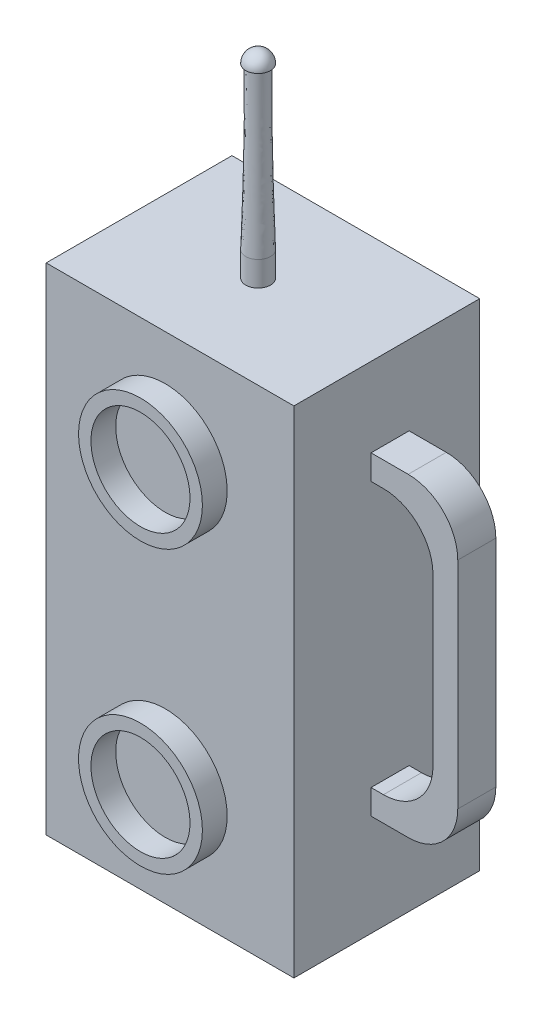
ISO-10303-21;
HEADER;
FILE_DESCRIPTION(('STEP AP214'),'2;1');
FILE_NAME('part.step','',(''),(''),'','','');
FILE_SCHEMA(('AUTOMOTIVE_DESIGN { 1 0 10303 214 1 1 1 1 }'));
ENDSEC;
DATA;
#1=APPLICATION_CONTEXT('core data for automotive mechanical design processes');
#2=APPLICATION_PROTOCOL_DEFINITION('international standard','automotive_design',2000,#1);
#3=PRODUCT_CONTEXT('',#1,'mechanical');
#4=PRODUCT('Part','Part','',(#3));
#5=PRODUCT_RELATED_PRODUCT_CATEGORY('part','',(#4));
#6=PRODUCT_DEFINITION_FORMATION('','',#4);
#7=PRODUCT_DEFINITION_CONTEXT('part definition',#1,'design');
#8=PRODUCT_DEFINITION('design','',#6,#7);
#9=PRODUCT_DEFINITION_SHAPE('','',#8);
#10=(LENGTH_UNIT() NAMED_UNIT(*) SI_UNIT(.MILLI.,.METRE.));
#11=(NAMED_UNIT(*) PLANE_ANGLE_UNIT() SI_UNIT($,.RADIAN.));
#12=(NAMED_UNIT(*) SI_UNIT($,.STERADIAN.) SOLID_ANGLE_UNIT());
#13=UNCERTAINTY_MEASURE_WITH_UNIT(LENGTH_MEASURE(1.E-05),#10,'distance_accuracy_value','');
#14=(GEOMETRIC_REPRESENTATION_CONTEXT(3) GLOBAL_UNCERTAINTY_ASSIGNED_CONTEXT((#13)) GLOBAL_UNIT_ASSIGNED_CONTEXT((#10,
#11,#12)) REPRESENTATION_CONTEXT('',''));
#15=CARTESIAN_POINT('',(0.,0.,0.));
#16=DIRECTION('',(0.,0.,1.));
#17=DIRECTION('',(1.,0.,0.));
#18=AXIS2_PLACEMENT_3D('',#15,#16,#17);
#19=CARTESIAN_POINT('',(10.,0.,7.5));
#20=DIRECTION('',(-1.,0.,0.));
#21=DIRECTION('',(0.,0.,1.));
#22=AXIS2_PLACEMENT_3D('',#19,#20,#21);
#23=PLANE('',#22);
#24=DIRECTION('',(0.,0.,1.));
#25=VECTOR('',#24,1.);
#26=CARTESIAN_POINT('',(10.,5.10199449169218,-0.614410883447841));
#27=LINE('',#26,#25);
#28=CARTESIAN_POINT('',(10.,5.10199449169218,2.84891246229432));
#29=VERTEX_POINT('',#28);
#30=CARTESIAN_POINT('',(10.,5.10199449169218,4.38558911655216));
#31=VERTEX_POINT('',#30);
#32=EDGE_CURVE('E222',#29,#31,#27,.T.);
#33=ORIENTED_EDGE('',*,*,#32,.F.);
#34=DIRECTION('',(0.,1.,0.));
#35=VECTOR('',#34,1.);
#36=CARTESIAN_POINT('',(10.,16.8021750754114,2.84891246229432));
#37=LINE('',#36,#35);
#38=CARTESIAN_POINT('',(10.,4.10199449169218,2.84891246229432));
#39=VERTEX_POINT('',#38);
#40=EDGE_CURVE('E241',#39,#29,#37,.T.);
#41=ORIENTED_EDGE('',*,*,#40,.F.);
#42=DIRECTION('',(0.,0.,-1.));
#43=VECTOR('',#42,1.);
#44=CARTESIAN_POINT('',(10.,4.10199449169218,2.84891246229432));
#45=LINE('',#44,#43);
#46=CARTESIAN_POINT('',(10.,4.10199449169218,4.38558911655216));
#47=VERTEX_POINT('',#46);
#48=EDGE_CURVE('E237',#47,#39,#45,.T.);
#49=ORIENTED_EDGE('',*,*,#48,.F.);
#50=DIRECTION('',(0.,-1.,0.));
#51=VECTOR('',#50,1.);
#52=CARTESIAN_POINT('',(10.,4.10199449169218,4.38558911655216));
#53=LINE('',#52,#51);
#54=EDGE_CURVE('E224',#31,#47,#53,.T.);
#55=ORIENTED_EDGE('',*,*,#54,.F.);
#56=EDGE_LOOP('',(#33,#41,#49,#55));
#57=FACE_BOUND('',#56,.T.);
#58=DIRECTION('',(0.,1.,0.));
#59=VECTOR('',#58,1.);
#60=CARTESIAN_POINT('',(10.,0.,0.));
#61=LINE('',#60,#59);
#62=CARTESIAN_POINT('',(10.,0.,0.));
#63=VERTEX_POINT('',#62);
#64=CARTESIAN_POINT('',(10.,20.,0.));
#65=VERTEX_POINT('',#64);
#66=EDGE_CURVE('E297',#63,#65,#61,.T.);
#67=ORIENTED_EDGE('',*,*,#66,.T.);
#68=DIRECTION('',(0.,0.,-1.));
#69=VECTOR('',#68,1.);
#70=CARTESIAN_POINT('',(10.,20.,7.5));
#71=LINE('',#70,#69);
#72=CARTESIAN_POINT('',(10.,20.,7.5));
#73=VERTEX_POINT('',#72);
#74=EDGE_CURVE('E302',#73,#65,#71,.T.);
#75=ORIENTED_EDGE('',*,*,#74,.F.);
#76=DIRECTION('',(0.,1.,0.));
#77=VECTOR('',#76,1.);
#78=CARTESIAN_POINT('',(10.,0.,7.5));
#79=LINE('',#78,#77);
#80=CARTESIAN_POINT('',(10.,0.,7.5));
#81=VERTEX_POINT('',#80);
#82=EDGE_CURVE('E288',#81,#73,#79,.T.);
#83=ORIENTED_EDGE('',*,*,#82,.F.);
#84=DIRECTION('',(0.,0.,-1.));
#85=VECTOR('',#84,1.);
#86=CARTESIAN_POINT('',(10.,0.,7.5));
#87=LINE('',#86,#85);
#88=EDGE_CURVE('E305',#81,#63,#87,.T.);
#89=ORIENTED_EDGE('',*,*,#88,.T.);
#90=EDGE_LOOP('',(#67,#75,#83,#89));
#91=FACE_BOUND('',#90,.T.);
#92=CARTESIAN_POINT('',(10.,15.8021750754114,2.84891246229432));
#93=VERTEX_POINT('',#92);
#94=CARTESIAN_POINT('',(10.,16.8021750754114,2.84891246229432));
#95=VERTEX_POINT('',#94);
#96=EDGE_CURVE('E240',#93,#95,#37,.T.);
#97=ORIENTED_EDGE('',*,*,#96,.F.);
#98=DIRECTION('',(0.,0.,1.));
#99=VECTOR('',#98,1.);
#100=CARTESIAN_POINT('',(10.,15.8021750754114,-0.614410883447841));
#101=LINE('',#100,#99);
#102=CARTESIAN_POINT('',(10.,15.8021750754114,4.38558911655216));
#103=VERTEX_POINT('',#102);
#104=EDGE_CURVE('E221',#93,#103,#101,.T.);
#105=ORIENTED_EDGE('',*,*,#104,.T.);
#106=CARTESIAN_POINT('',(10.,16.8021750754114,4.38558911655216));
#107=VERTEX_POINT('',#106);
#108=EDGE_CURVE('E234',#107,#103,#53,.T.);
#109=ORIENTED_EDGE('',*,*,#108,.F.);
#110=DIRECTION('',(0.,0.,1.));
#111=VECTOR('',#110,1.);
#112=CARTESIAN_POINT('',(10.,16.8021750754114,4.38558911655216));
#113=LINE('',#112,#111);
#114=EDGE_CURVE('E231',#95,#107,#113,.T.);
#115=ORIENTED_EDGE('',*,*,#114,.F.);
#116=EDGE_LOOP('',(#97,#105,#109,#115));
#117=FACE_BOUND('',#116,.T.);
#118=ADVANCED_FACE('F53',(#57,#91,#117),#23,.F.);
#119=CARTESIAN_POINT('',(0.,0.,7.5));
#120=DIRECTION('',(1.,0.,0.));
#121=DIRECTION('',(0.,0.,-1.));
#122=AXIS2_PLACEMENT_3D('',#119,#120,#121);
#123=PLANE('',#122);
#124=DIRECTION('',(0.,-1.,0.));
#125=VECTOR('',#124,1.);
#126=CARTESIAN_POINT('',(0.,0.,0.));
#127=LINE('',#126,#125);
#128=CARTESIAN_POINT('',(0.,20.,0.));
#129=VERTEX_POINT('',#128);
#130=CARTESIAN_POINT('',(0.,0.,0.));
#131=VERTEX_POINT('',#130);
#132=EDGE_CURVE('E281',#129,#131,#127,.T.);
#133=ORIENTED_EDGE('',*,*,#132,.T.);
#134=DIRECTION('',(0.,0.,-1.));
#135=VECTOR('',#134,1.);
#136=CARTESIAN_POINT('',(0.,0.,7.5));
#137=LINE('',#136,#135);
#138=CARTESIAN_POINT('',(0.,0.,7.5));
#139=VERTEX_POINT('',#138);
#140=EDGE_CURVE('E308',#139,#131,#137,.T.);
#141=ORIENTED_EDGE('',*,*,#140,.F.);
#142=DIRECTION('',(0.,-1.,0.));
#143=VECTOR('',#142,1.);
#144=CARTESIAN_POINT('',(0.,0.,7.5));
#145=LINE('',#144,#143);
#146=CARTESIAN_POINT('',(0.,20.,7.5));
#147=VERTEX_POINT('',#146);
#148=EDGE_CURVE('E282',#147,#139,#145,.T.);
#149=ORIENTED_EDGE('',*,*,#148,.F.);
#150=DIRECTION('',(0.,0.,-1.));
#151=VECTOR('',#150,1.);
#152=CARTESIAN_POINT('',(0.,20.,7.5));
#153=LINE('',#152,#151);
#154=EDGE_CURVE('E292',#147,#129,#153,.T.);
#155=ORIENTED_EDGE('',*,*,#154,.T.);
#156=EDGE_LOOP('',(#133,#141,#149,#155));
#157=FACE_BOUND('',#156,.T.);
#158=ADVANCED_FACE('F421',(#157),#123,.F.);
#159=CARTESIAN_POINT('',(0.,0.,7.5));
#160=DIRECTION('',(0.,1.,0.));
#161=DIRECTION('',(0.,0.,1.));
#162=AXIS2_PLACEMENT_3D('',#159,#160,#161);
#163=PLANE('',#162);
#164=DIRECTION('',(1.,0.,0.));
#165=VECTOR('',#164,1.);
#166=CARTESIAN_POINT('',(0.,0.,0.));
#167=LINE('',#166,#165);
#168=EDGE_CURVE('E295',#131,#63,#167,.T.);
#169=ORIENTED_EDGE('',*,*,#168,.T.);
#170=ORIENTED_EDGE('',*,*,#88,.F.);
#171=DIRECTION('',(1.,0.,0.));
#172=VECTOR('',#171,1.);
#173=CARTESIAN_POINT('',(0.,0.,7.5));
#174=LINE('',#173,#172);
#175=EDGE_CURVE('E285',#139,#81,#174,.T.);
#176=ORIENTED_EDGE('',*,*,#175,.F.);
#177=ORIENTED_EDGE('',*,*,#140,.T.);
#178=EDGE_LOOP('',(#169,#170,#176,#177));
#179=FACE_BOUND('',#178,.T.);
#180=ADVANCED_FACE('F441',(#179),#163,.F.);
#181=CARTESIAN_POINT('',(0.,20.,7.5));
#182=DIRECTION('',(0.,-1.,0.));
#183=DIRECTION('',(0.,0.,-1.));
#184=AXIS2_PLACEMENT_3D('',#181,#182,#183);
#185=PLANE('',#184);
#186=CARTESIAN_POINT('',(4.80630126206834,20.,3.75));
#187=DIRECTION('',(0.,-1.,0.));
#188=DIRECTION('',(0.,0.,-1.));
#189=AXIS2_PLACEMENT_3D('',#186,#187,#188);
#190=CIRCLE('',#189,0.500000000000001);
#191=CARTESIAN_POINT('',(4.80630126206834,20.,3.25));
#192=VERTEX_POINT('',#191);
#193=EDGE_CURVE('E314',#192,#192,#190,.F.);
#194=ORIENTED_EDGE('',*,*,#193,.F.);
#195=EDGE_LOOP('',(#194));
#196=FACE_BOUND('',#195,.T.);
#197=DIRECTION('',(-1.,0.,0.));
#198=VECTOR('',#197,1.);
#199=CARTESIAN_POINT('',(0.,20.,0.));
#200=LINE('',#199,#198);
#201=EDGE_CURVE('E286',#65,#129,#200,.T.);
#202=ORIENTED_EDGE('',*,*,#201,.T.);
#203=ORIENTED_EDGE('',*,*,#154,.F.);
#204=DIRECTION('',(-1.,0.,0.));
#205=VECTOR('',#204,1.);
#206=CARTESIAN_POINT('',(0.,20.,7.5));
#207=LINE('',#206,#205);
#208=EDGE_CURVE('E290',#73,#147,#207,.T.);
#209=ORIENTED_EDGE('',*,*,#208,.F.);
#210=ORIENTED_EDGE('',*,*,#74,.T.);
#211=EDGE_LOOP('',(#202,#203,#209,#210));
#212=FACE_BOUND('',#211,.T.);
#213=ADVANCED_FACE('F431',(#196,#212),#185,.F.);
#214=CARTESIAN_POINT('',(0.,0.,7.5));
#215=DIRECTION('',(0.,0.,-1.));
#216=DIRECTION('',(-1.,0.,0.));
#217=AXIS2_PLACEMENT_3D('',#214,#215,#216);
#218=PLANE('',#217);
#219=CARTESIAN_POINT('',(4.80630126206834,4.3181703540046,7.5));
#220=DIRECTION('',(0.,0.,-1.));
#221=DIRECTION('',(1.,0.,0.));
#222=AXIS2_PLACEMENT_3D('',#219,#220,#221);
#223=CIRCLE('',#222,2.5);
#224=CARTESIAN_POINT('',(7.30630126206834,4.3181703540046,7.5));
#225=VERTEX_POINT('',#224);
#226=EDGE_CURVE('E263',#225,#225,#223,.T.);
#227=ORIENTED_EDGE('',*,*,#226,.T.);
#228=EDGE_LOOP('',(#227));
#229=FACE_BOUND('',#228,.T.);
#230=CARTESIAN_POINT('',(4.80630126206834,15.6818296459954,7.5));
#231=DIRECTION('',(0.,0.,-1.));
#232=DIRECTION('',(-1.,0.,0.));
#233=AXIS2_PLACEMENT_3D('',#230,#231,#232);
#234=CIRCLE('',#233,2.5);
#235=CARTESIAN_POINT('',(2.30630126206834,15.6818296459954,7.5));
#236=VERTEX_POINT('',#235);
#237=EDGE_CURVE('E311',#236,#236,#234,.F.);
#238=ORIENTED_EDGE('',*,*,#237,.F.);
#239=EDGE_LOOP('',(#238));
#240=FACE_BOUND('',#239,.T.);
#241=ORIENTED_EDGE('',*,*,#148,.T.);
#242=ORIENTED_EDGE('',*,*,#175,.T.);
#243=ORIENTED_EDGE('',*,*,#82,.T.);
#244=ORIENTED_EDGE('',*,*,#208,.T.);
#245=EDGE_LOOP('',(#241,#242,#243,#244));
#246=FACE_BOUND('',#245,.T.);
#247=ADVANCED_FACE('F439',(#229,#240,#246),#218,.F.);
#248=CARTESIAN_POINT('',(0.,0.,0.));
#249=DIRECTION('',(0.,0.,-1.));
#250=DIRECTION('',(-1.,0.,0.));
#251=AXIS2_PLACEMENT_3D('',#248,#249,#250);
#252=PLANE('',#251);
#253=DIRECTION('',(0.,-1.,0.));
#254=VECTOR('',#253,1.);
#255=CARTESIAN_POINT('',(6.47882176689568,12.4860425935454,0.));
#256=LINE('',#255,#254);
#257=CARTESIAN_POINT('',(6.47882176689568,12.4860425935454,0.));
#258=VERTEX_POINT('',#257);
#259=CARTESIAN_POINT('',(6.47882176689567,8.48604259354542,0.));
#260=VERTEX_POINT('',#259);
#261=EDGE_CURVE('E68',#258,#260,#256,.T.);
#262=ORIENTED_EDGE('',*,*,#261,.F.);
#263=DIRECTION('',(1.,0.,0.));
#264=VECTOR('',#263,1.);
#265=CARTESIAN_POINT('',(6.47882176689568,12.4860425935454,0.));
#266=LINE('',#265,#264);
#267=CARTESIAN_POINT('',(2.47882176689568,12.4860425935454,0.));
#268=VERTEX_POINT('',#267);
#269=EDGE_CURVE('E72',#268,#258,#266,.T.);
#270=ORIENTED_EDGE('',*,*,#269,.F.);
#271=DIRECTION('',(0.,1.,0.));
#272=VECTOR('',#271,1.);
#273=CARTESIAN_POINT('',(2.47882176689568,12.4860425935454,0.));
#274=LINE('',#273,#272);
#275=CARTESIAN_POINT('',(2.47882176689567,8.48604259354542,0.));
#276=VERTEX_POINT('',#275);
#277=EDGE_CURVE('E774',#276,#268,#274,.T.);
#278=ORIENTED_EDGE('',*,*,#277,.F.);
#279=DIRECTION('',(-1.,0.,0.));
#280=VECTOR('',#279,1.);
#281=CARTESIAN_POINT('',(6.47882176689567,8.48604259354542,0.));
#282=LINE('',#281,#280);
#283=EDGE_CURVE('E780',#260,#276,#282,.T.);
#284=ORIENTED_EDGE('',*,*,#283,.F.);
#285=EDGE_LOOP('',(#262,#270,#278,#284));
#286=FACE_BOUND('',#285,.T.);
#287=ORIENTED_EDGE('',*,*,#132,.F.);
#288=ORIENTED_EDGE('',*,*,#201,.F.);
#289=ORIENTED_EDGE('',*,*,#66,.F.);
#290=ORIENTED_EDGE('',*,*,#168,.F.);
#291=EDGE_LOOP('',(#287,#288,#289,#290));
#292=FACE_BOUND('',#291,.T.);
#293=ADVANCED_FACE('F434',(#286,#292),#252,.T.);
#294=CARTESIAN_POINT('',(4.80630126206834,15.6818296459954,8.5));
#295=DIRECTION('',(0.,0.,-1.));
#296=DIRECTION('',(-1.,0.,0.));
#297=AXIS2_PLACEMENT_3D('',#294,#295,#296);
#298=CYLINDRICAL_SURFACE('',#297,2.5);
#299=CARTESIAN_POINT('',(4.80630126206834,15.6818296459954,8.5));
#300=DIRECTION('',(0.,0.,1.));
#301=DIRECTION('',(1.,0.,0.));
#302=AXIS2_PLACEMENT_3D('',#299,#300,#301);
#303=CIRCLE('',#302,2.5);
#304=CARTESIAN_POINT('',(7.30630126206834,15.6818296459954,8.5));
#305=VERTEX_POINT('',#304);
#306=EDGE_CURVE('E276',#305,#305,#303,.T.);
#307=ORIENTED_EDGE('',*,*,#306,.F.);
#308=EDGE_LOOP('',(#307));
#309=FACE_BOUND('',#308,.T.);
#310=ORIENTED_EDGE('',*,*,#237,.T.);
#311=EDGE_LOOP('',(#310));
#312=FACE_BOUND('',#311,.T.);
#313=ADVANCED_FACE('F540',(#309,#312),#298,.T.);
#314=CARTESIAN_POINT('',(4.80630126206834,15.6818296459954,8.5));
#315=DIRECTION('',(0.,0.,1.));
#316=DIRECTION('',(1.,0.,0.));
#317=AXIS2_PLACEMENT_3D('',#314,#315,#316);
#318=PLANE('',#317);
#319=CARTESIAN_POINT('',(4.80630126206834,15.6818296459954,8.5));
#320=DIRECTION('',(0.,0.,1.));
#321=DIRECTION('',(1.,0.,0.));
#322=AXIS2_PLACEMENT_3D('',#319,#320,#321);
#323=CIRCLE('',#322,2.);
#324=CARTESIAN_POINT('',(6.80630126206834,15.6818296459954,8.5));
#325=VERTEX_POINT('',#324);
#326=EDGE_CURVE('E270',#325,#325,#323,.T.);
#327=ORIENTED_EDGE('',*,*,#326,.F.);
#328=EDGE_LOOP('',(#327));
#329=FACE_BOUND('',#328,.T.);
#330=ORIENTED_EDGE('',*,*,#306,.T.);
#331=EDGE_LOOP('',(#330));
#332=FACE_BOUND('',#331,.T.);
#333=ADVANCED_FACE('F536',(#329,#332),#318,.T.);
#334=CARTESIAN_POINT('',(4.80630126206834,15.6818296459954,7.5));
#335=DIRECTION('',(0.,0.,1.));
#336=DIRECTION('',(1.,0.,0.));
#337=AXIS2_PLACEMENT_3D('',#334,#335,#336);
#338=CYLINDRICAL_SURFACE('',#337,2.);
#339=CARTESIAN_POINT('',(4.80630126206834,15.6818296459954,7.5));
#340=DIRECTION('',(0.,0.,1.));
#341=DIRECTION('',(1.,0.,0.));
#342=AXIS2_PLACEMENT_3D('',#339,#340,#341);
#343=CIRCLE('',#342,2.);
#344=CARTESIAN_POINT('',(6.80630126206834,15.6818296459954,7.5));
#345=VERTEX_POINT('',#344);
#346=EDGE_CURVE('E273',#345,#345,#343,.T.);
#347=ORIENTED_EDGE('',*,*,#346,.F.);
#348=EDGE_LOOP('',(#347));
#349=FACE_BOUND('',#348,.T.);
#350=ORIENTED_EDGE('',*,*,#326,.T.);
#351=EDGE_LOOP('',(#350));
#352=FACE_BOUND('',#351,.T.);
#353=ADVANCED_FACE('F532',(#349,#352),#338,.F.);
#354=CARTESIAN_POINT('',(4.80630126206834,15.6818296459954,7.5));
#355=DIRECTION('',(0.,0.,1.));
#356=DIRECTION('',(1.,0.,0.));
#357=AXIS2_PLACEMENT_3D('',#354,#355,#356);
#358=PLANE('',#357);
#359=ORIENTED_EDGE('',*,*,#346,.T.);
#360=EDGE_LOOP('',(#359));
#361=FACE_BOUND('',#360,.T.);
#362=ADVANCED_FACE('F528',(#361),#358,.T.);
#363=CARTESIAN_POINT('',(4.80630126206834,4.3181703540046,8.5));
#364=DIRECTION('',(0.,0.,-1.));
#365=DIRECTION('',(-1.,0.,0.));
#366=AXIS2_PLACEMENT_3D('',#363,#364,#365);
#367=CYLINDRICAL_SURFACE('',#366,2.5);
#368=CARTESIAN_POINT('',(4.80630126206834,4.3181703540046,8.5));
#369=DIRECTION('',(0.,0.,-1.));
#370=DIRECTION('',(1.,0.,0.));
#371=AXIS2_PLACEMENT_3D('',#368,#369,#370);
#372=CIRCLE('',#371,2.5);
#373=CARTESIAN_POINT('',(7.30630126206834,4.3181703540046,8.5));
#374=VERTEX_POINT('',#373);
#375=EDGE_CURVE('E267',#374,#374,#372,.T.);
#376=ORIENTED_EDGE('',*,*,#375,.T.);
#377=EDGE_LOOP('',(#376));
#378=FACE_BOUND('',#377,.T.);
#379=ORIENTED_EDGE('',*,*,#226,.F.);
#380=EDGE_LOOP('',(#379));
#381=FACE_BOUND('',#380,.T.);
#382=ADVANCED_FACE('F524',(#378,#381),#367,.T.);
#383=CARTESIAN_POINT('',(4.80630126206834,4.3181703540046,8.5));
#384=DIRECTION('',(0.,0.,1.));
#385=DIRECTION('',(1.,0.,0.));
#386=AXIS2_PLACEMENT_3D('',#383,#384,#385);
#387=PLANE('',#386);
#388=CARTESIAN_POINT('',(4.80630126206834,4.3181703540046,8.5));
#389=DIRECTION('',(0.,0.,-1.));
#390=DIRECTION('',(1.,0.,0.));
#391=AXIS2_PLACEMENT_3D('',#388,#389,#390);
#392=CIRCLE('',#391,2.);
#393=CARTESIAN_POINT('',(6.80630126206834,4.3181703540046,8.5));
#394=VERTEX_POINT('',#393);
#395=EDGE_CURVE('E264',#394,#394,#392,.T.);
#396=ORIENTED_EDGE('',*,*,#395,.T.);
#397=EDGE_LOOP('',(#396));
#398=FACE_BOUND('',#397,.T.);
#399=ORIENTED_EDGE('',*,*,#375,.F.);
#400=EDGE_LOOP('',(#399));
#401=FACE_BOUND('',#400,.T.);
#402=ADVANCED_FACE('F520',(#398,#401),#387,.T.);
#403=CARTESIAN_POINT('',(4.80630126206834,4.3181703540046,7.5));
#404=DIRECTION('',(0.,0.,1.));
#405=DIRECTION('',(1.,0.,0.));
#406=AXIS2_PLACEMENT_3D('',#403,#404,#405);
#407=CYLINDRICAL_SURFACE('',#406,2.);
#408=CARTESIAN_POINT('',(4.80630126206834,4.3181703540046,7.5));
#409=DIRECTION('',(0.,0.,-1.));
#410=DIRECTION('',(1.,0.,0.));
#411=AXIS2_PLACEMENT_3D('',#408,#409,#410);
#412=CIRCLE('',#411,2.);
#413=CARTESIAN_POINT('',(6.80630126206834,4.3181703540046,7.5));
#414=VERTEX_POINT('',#413);
#415=EDGE_CURVE('E260',#414,#414,#412,.T.);
#416=ORIENTED_EDGE('',*,*,#415,.T.);
#417=EDGE_LOOP('',(#416));
#418=FACE_BOUND('',#417,.T.);
#419=ORIENTED_EDGE('',*,*,#395,.F.);
#420=EDGE_LOOP('',(#419));
#421=FACE_BOUND('',#420,.T.);
#422=ADVANCED_FACE('F516',(#418,#421),#407,.F.);
#423=CARTESIAN_POINT('',(4.80630126206834,4.3181703540046,7.5));
#424=DIRECTION('',(0.,0.,1.));
#425=DIRECTION('',(1.,0.,0.));
#426=AXIS2_PLACEMENT_3D('',#423,#424,#425);
#427=PLANE('',#426);
#428=ORIENTED_EDGE('',*,*,#415,.F.);
#429=EDGE_LOOP('',(#428));
#430=FACE_BOUND('',#429,.T.);
#431=ADVANCED_FACE('F512',(#430),#427,.T.);
#432=CARTESIAN_POINT('',(4.80630126206834,21.,3.75));
#433=DIRECTION('',(0.,-1.,0.));
#434=DIRECTION('',(0.,0.,-1.));
#435=AXIS2_PLACEMENT_3D('',#432,#433,#434);
#436=CYLINDRICAL_SURFACE('',#435,0.500000000000001);
#437=CARTESIAN_POINT('',(4.80630126206834,21.,3.75));
#438=DIRECTION('',(0.,-1.,0.));
#439=DIRECTION('',(0.,0.,-1.));
#440=AXIS2_PLACEMENT_3D('',#437,#438,#439);
#441=CIRCLE('',#440,0.500000000000001);
#442=CARTESIAN_POINT('',(5.0627123726465,21.,4.17924741393755));
#443=VERTEX_POINT('',#442);
#444=EDGE_CURVE('E259',#443,#443,#441,.F.);
#445=ORIENTED_EDGE('',*,*,#444,.F.);
#446=EDGE_LOOP('',(#445));
#447=FACE_BOUND('',#446,.T.);
#448=ORIENTED_EDGE('',*,*,#193,.T.);
#449=EDGE_LOOP('',(#448));
#450=FACE_BOUND('',#449,.T.);
#451=ADVANCED_FACE('F503',(#447,#450),#436,.T.);
#452=CARTESIAN_POINT('',(5.0627123726465,21.,4.17924741393755));
#453=CARTESIAN_POINT('',(4.70123696473287,27.5,4.13595529977629));
#454=CARTESIAN_POINT('',(5.9212072005216,21.,3.66642519278124));
#455=CARTESIAN_POINT('',(5.47314756428544,27.5,4.34608389444723));
#456=CARTESIAN_POINT('',(5.40838497936529,21.,2.80793036490613));
#457=CARTESIAN_POINT('',(5.68327615895639,27.5,3.57417329489466));
#458=CARTESIAN_POINT('',(4.54989015149018,21.,3.32075258606245));
#459=CARTESIAN_POINT('',(4.91136555940382,27.5,3.36404470022371));
#460=CARTESIAN_POINT('',(3.69139532361508,21.,3.83357480721876));
#461=CARTESIAN_POINT('',(4.13945495985124,27.5,3.15391610555276));
#462=CARTESIAN_POINT('',(4.20421754477139,21.,4.69206963509387));
#463=CARTESIAN_POINT('',(3.92932636518029,27.5,3.92582670510534));
#464=CARTESIAN_POINT('',(5.0627123726465,21.,4.17924741393755));
#465=CARTESIAN_POINT('',(4.70123696473287,27.5,4.13595529977629));
#466=(BOUNDED_SURFACE() B_SPLINE_SURFACE(3,1,((#452,#453),(#454,#455),(#456,#457),(#458,#459),
(#460,#461),(#462,#463),(#464,#465)),.UNSPECIFIED.,.T.,.F.,.F.) B_SPLINE_SURFACE_WITH_KNOTS((4,
3,4),(2,2),(0.,0.5,1.),(0.,1.),
.UNSPECIFIED.) GEOMETRIC_REPRESENTATION_ITEM() RATIONAL_B_SPLINE_SURFACE(((1.,1.),
(0.333333333333333,0.333333333333334),(0.333333333333333,0.333333333333334),(1.,1.),
(0.333333333333334,0.333333333333333),(0.333333333333334,0.333333333333333),(1.,1.))) REPRESENTATION_ITEM('') SURFACE());
#467=CARTESIAN_POINT('',(4.80630126206834,27.5,3.75));
#468=DIRECTION('',(0.,1.,0.));
#469=DIRECTION('',(0.,0.,1.));
#470=AXIS2_PLACEMENT_3D('',#467,#468,#469);
#471=CIRCLE('',#470,0.4);
#472=CARTESIAN_POINT('',(4.70123696473287,27.5,4.13595529977629));
#473=VERTEX_POINT('',#472);
#474=EDGE_CURVE('E256',#473,#473,#471,.T.);
#475=CARTESIAN_POINT('',(5.0627123726465,21.,4.17924741393755));
#476=CARTESIAN_POINT('',(5.05894700381406,21.0677083333333,4.17879645441504));
#477=CARTESIAN_POINT('',(5.05518163498163,21.1354166666667,4.17834549489253));
#478=CARTESIAN_POINT('',(5.04765089731676,21.2708333333333,4.1774435758475));
#479=CARTESIAN_POINT('',(5.04388552848433,21.3385416666667,4.17699261632499));
#480=CARTESIAN_POINT('',(5.03635479081946,21.4739583333333,4.17609069727996));
#481=CARTESIAN_POINT('',(5.03258942198703,21.5416666666667,4.17563973775745));
#482=CARTESIAN_POINT('',(5.02505868432216,21.6770833333333,4.17473781871242));
#483=CARTESIAN_POINT('',(5.02129331548973,21.7447916666667,4.17428685918991));
#484=CARTESIAN_POINT('',(5.01376257782486,21.8802083333333,4.17338494014488));
#485=CARTESIAN_POINT('',(5.00999720899243,21.9479166666667,4.17293398062237));
#486=CARTESIAN_POINT('',(5.00246647132756,22.0833333333333,4.17203206157734));
#487=CARTESIAN_POINT('',(4.99870110249513,22.1510416666667,4.17158110205483));
#488=CARTESIAN_POINT('',(4.99117036483026,22.2864583333333,4.1706791830098));
#489=CARTESIAN_POINT('',(4.98740499599783,22.3541666666667,4.17022822348729));
#490=CARTESIAN_POINT('',(4.97987425833296,22.4895833333333,4.16932630444226));
#491=CARTESIAN_POINT('',(4.97610888950052,22.5572916666667,4.16887534491975));
#492=CARTESIAN_POINT('',(4.96857815183566,22.6927083333333,4.16797342587472));
#493=CARTESIAN_POINT('',(4.96481278300322,22.7604166666667,4.16752246635221));
#494=CARTESIAN_POINT('',(4.95728204533836,22.8958333333333,4.16662054730718));
#495=CARTESIAN_POINT('',(4.95351667650592,22.9635416666667,4.16616958778467));
#496=CARTESIAN_POINT('',(4.94598593884106,23.0989583333333,4.16526766873964));
#497=CARTESIAN_POINT('',(4.94222057000862,23.1666666666667,4.16481670921713));
#498=CARTESIAN_POINT('',(4.93468983234375,23.3020833333333,4.1639147901721));
#499=CARTESIAN_POINT('',(4.93092446351132,23.3697916666667,4.16346383064959));
#500=CARTESIAN_POINT('',(4.92339372584645,23.5052083333333,4.16256191160456));
#501=CARTESIAN_POINT('',(4.91962835701402,23.5729166666667,4.16211095208205));
#502=CARTESIAN_POINT('',(4.91209761934915,23.7083333333333,4.16120903303702));
#503=CARTESIAN_POINT('',(4.90833225051672,23.7760416666667,4.16075807351451));
#504=CARTESIAN_POINT('',(4.90080151285185,23.9114583333333,4.15985615446948));
#505=CARTESIAN_POINT('',(4.89703614401942,23.9791666666667,4.15940519494697));
#506=CARTESIAN_POINT('',(4.88950540635455,24.1145833333333,4.15850327590195));
#507=CARTESIAN_POINT('',(4.88574003752212,24.1822916666667,4.15805231637943));
#508=CARTESIAN_POINT('',(4.87820929985725,24.3177083333333,4.15715039733441));
#509=CARTESIAN_POINT('',(4.87444393102482,24.3854166666667,4.15669943781189));
#510=CARTESIAN_POINT('',(4.86691319335995,24.5208333333333,4.15579751876687));
#511=CARTESIAN_POINT('',(4.86314782452751,24.5885416666667,4.15534655924435));
#512=CARTESIAN_POINT('',(4.85561708686265,24.7239583333333,4.15444464019933));
#513=CARTESIAN_POINT('',(4.85185171803021,24.7916666666667,4.15399368067681));
#514=CARTESIAN_POINT('',(4.84432098036535,24.9270833333333,4.15309176163179));
#515=CARTESIAN_POINT('',(4.84055561153291,24.9947916666667,4.15264080210927));
#516=CARTESIAN_POINT('',(4.83302487386805,25.1302083333333,4.15173888306425));
#517=CARTESIAN_POINT('',(4.82925950503561,25.1979166666667,4.15128792354174));
#518=CARTESIAN_POINT('',(4.82172876737074,25.3333333333333,4.15038600449671));
#519=CARTESIAN_POINT('',(4.81796339853831,25.4010416666667,4.1499350449742));
#520=CARTESIAN_POINT('',(4.81043266087344,25.5364583333333,4.14903312592917));
#521=CARTESIAN_POINT('',(4.80666729204101,25.6041666666667,4.14858216640666));
#522=CARTESIAN_POINT('',(4.79913655437614,25.7395833333333,4.14768024736163));
#523=CARTESIAN_POINT('',(4.79537118554371,25.8072916666667,4.14722928783912));
#524=CARTESIAN_POINT('',(4.78784044787884,25.9427083333333,4.14632736879409));
#525=CARTESIAN_POINT('',(4.78407507904641,26.0104166666667,4.14587640927158));
#526=CARTESIAN_POINT('',(4.77654434138154,26.1458333333333,4.14497449022655));
#527=CARTESIAN_POINT('',(4.77277897254911,26.2135416666667,4.14452353070404));
#528=CARTESIAN_POINT('',(4.76524823488424,26.3489583333333,4.14362161165901));
#529=CARTESIAN_POINT('',(4.76148286605181,26.4166666666667,4.1431706521365));
#530=CARTESIAN_POINT('',(4.75395212838694,26.5520833333333,4.14226873309147));
#531=CARTESIAN_POINT('',(4.7501867595545,26.6197916666667,4.14181777356896));
#532=CARTESIAN_POINT('',(4.74265602188964,26.7552083333333,4.14091585452393));
#533=CARTESIAN_POINT('',(4.7388906530572,26.8229166666667,4.14046489500142));
#534=CARTESIAN_POINT('',(4.73135991539234,26.9583333333333,4.13956297595639));
#535=CARTESIAN_POINT('',(4.7275945465599,27.0260416666667,4.13911201643388));
#536=CARTESIAN_POINT('',(4.72006380889504,27.1614583333333,4.13821009738885));
#537=CARTESIAN_POINT('',(4.7162984400626,27.2291666666667,4.13775913786634));
#538=CARTESIAN_POINT('',(4.70876770239773,27.3645833333333,4.13685721882131));
#539=CARTESIAN_POINT('',(4.7050023335653,27.4322916666667,4.1364062592988));
#540=CARTESIAN_POINT('',(4.70123696473287,27.5,4.13595529977629));
#541=B_SPLINE_CURVE_WITH_KNOTS('',3,(#475,#476,#477,#478,#479,#480,#481,#482,#483,#484,#485,
#486,#487,#488,#489,#490,#491,#492,#493,#494,#495,#496,#497,#498,#499,#500,#501,#502,#503,#504,
#505,#506,#507,#508,#509,#510,#511,#512,#513,#514,#515,#516,#517,#518,#519,#520,#521,#522,#523,
#524,#525,#526,#527,#528,#529,#530,#531,#532,#533,#534,#535,#536,#537,#538,#539,#540),
.UNSPECIFIED.,.F.,.F.,(4,2,2,2,2,2,2,2,2,2,2,2,2,2,2,2,2,2,2,2,2,2,2,2,2,2,2,2,2,2,2,2,4),(0.,
0.203443353116823,0.406886706233649,0.610330059350472,0.813773412467298,1.01721676558412,
1.22066011870095,1.42410347181777,1.62754682493459,1.83099017805142,2.03443353116825,
2.23787688428507,2.44132023740189,2.64476359051871,2.84820694363554,3.05165029675237,
3.25509364986919,3.45853700298601,3.66198035610284,3.86542370921966,4.06886706233649,
4.27231041545331,4.47575376857013,4.67919712168696,4.88264047480378,5.08608382792061,
5.28952718103743,5.49297053415426,5.69641388727108,5.8998572403879,6.10330059350473,
6.30674394662155,6.51018729973837),.UNSPECIFIED.);
#542=EDGE_CURVE('BSEAM497',#443,#473,#541,.T.);
#543=ORIENTED_EDGE('',*,*,#444,.T.);
#544=ORIENTED_EDGE('',*,*,#474,.F.);
#545=ORIENTED_EDGE('',*,*,#542,.T.);
#546=ORIENTED_EDGE('',*,*,#542,.F.);
#547=EDGE_LOOP('',(#543,#545,#544,#546));
#548=FACE_BOUND('',#547,.T.);
#549=ADVANCED_FACE('F497',(#548),#466,.T.);
#550=CARTESIAN_POINT('',(4.80630126206834,27.5,3.75));
#551=DIRECTION('',(0.,-1.,0.));
#552=DIRECTION('',(0.,0.,-1.));
#553=AXIS2_PLACEMENT_3D('',#550,#551,#552);
#554=PLANE('',#553);
#555=ORIENTED_EDGE('',*,*,#474,.T.);
#556=EDGE_LOOP('',(#555));
#557=FACE_BOUND('',#556,.T.);
#558=CARTESIAN_POINT('',(4.80630126206834,27.5,3.75));
#559=DIRECTION('',(0.,1.,0.));
#560=DIRECTION('',(0.,0.,1.));
#561=AXIS2_PLACEMENT_3D('',#558,#559,#560);
#562=CIRCLE('',#561,0.5);
#563=CARTESIAN_POINT('',(4.80630126206834,27.5,4.25));
#564=VERTEX_POINT('',#563);
#565=EDGE_CURVE('E253',#564,#564,#562,.T.);
#566=ORIENTED_EDGE('',*,*,#565,.F.);
#567=EDGE_LOOP('',(#566));
#568=FACE_BOUND('',#567,.T.);
#569=ADVANCED_FACE('F493',(#557,#568),#554,.T.);
#570=CARTESIAN_POINT('',(4.80630126206834,27.5,3.75));
#571=DIRECTION('',(0.,1.,0.));
#572=DIRECTION('',(1.,0.,0.));
#573=AXIS2_PLACEMENT_3D('',#570,#571,#572);
#574=SPHERICAL_SURFACE('',#573,0.5);
#575=ORIENTED_EDGE('',*,*,#565,.T.);
#576=EDGE_LOOP('',(#575));
#577=FACE_BOUND('',#576,.T.);
#578=ADVANCED_FACE('F490',(#577),#574,.T.);
#579=CARTESIAN_POINT('',(13.5,4.10199449169218,4.38558911655216));
#580=DIRECTION('',(0.,0.,-1.));
#581=DIRECTION('',(-1.,0.,0.));
#582=AXIS2_PLACEMENT_3D('',#579,#580,#581);
#583=PLANE('',#582);
#584=DIRECTION('',(-1.,0.,0.));
#585=VECTOR('',#584,1.);
#586=CARTESIAN_POINT('',(13.5,4.10199449169218,4.38558911655216));
#587=LINE('',#586,#585);
#588=CARTESIAN_POINT('',(11.5,4.10199449169218,4.38558911655216));
#589=VERTEX_POINT('',#588);
#590=EDGE_CURVE('E251',#589,#47,#587,.T.);
#591=ORIENTED_EDGE('',*,*,#590,.F.);
#592=CARTESIAN_POINT('',(11.5,6.10199449169217,4.38558911655216));
#593=DIRECTION('',(0.,0.,-1.));
#594=DIRECTION('',(-1.,0.,0.));
#595=AXIS2_PLACEMENT_3D('',#592,#593,#594);
#596=CIRCLE('',#595,2.);
#597=CARTESIAN_POINT('',(13.5,6.10199449169217,4.38558911655216));
#598=VERTEX_POINT('',#597);
#599=EDGE_CURVE('E356',#589,#598,#596,.F.);
#600=ORIENTED_EDGE('',*,*,#599,.T.);
#601=DIRECTION('',(0.,-1.,0.));
#602=VECTOR('',#601,1.);
#603=CARTESIAN_POINT('',(13.5,4.10199449169218,4.38558911655216));
#604=LINE('',#603,#602);
#605=CARTESIAN_POINT('',(13.5,14.8021750754114,4.38558911655216));
#606=VERTEX_POINT('',#605);
#607=EDGE_CURVE('E227',#606,#598,#604,.T.);
#608=ORIENTED_EDGE('',*,*,#607,.F.);
#609=CARTESIAN_POINT('',(11.5,14.8021750754114,4.38558911655216));
#610=DIRECTION('',(0.,0.,-1.));
#611=DIRECTION('',(-1.,0.,0.));
#612=AXIS2_PLACEMENT_3D('',#609,#610,#611);
#613=CIRCLE('',#612,2.);
#614=CARTESIAN_POINT('',(11.5,16.8021750754114,4.38558911655216));
#615=VERTEX_POINT('',#614);
#616=EDGE_CURVE('E331',#606,#615,#613,.F.);
#617=ORIENTED_EDGE('',*,*,#616,.T.);
#618=DIRECTION('',(-1.,0.,0.));
#619=VECTOR('',#618,1.);
#620=CARTESIAN_POINT('',(13.5,16.8021750754114,4.38558911655216));
#621=LINE('',#620,#619);
#622=EDGE_CURVE('E233',#615,#107,#621,.T.);
#623=ORIENTED_EDGE('',*,*,#622,.T.);
#624=ORIENTED_EDGE('',*,*,#108,.T.);
#625=DIRECTION('',(-1.,0.,0.));
#626=VECTOR('',#625,1.);
#627=CARTESIAN_POINT('',(12.5,15.8021750754114,4.38558911655216));
#628=LINE('',#627,#626);
#629=CARTESIAN_POINT('',(10.5,15.8021750754114,4.38558911655216));
#630=VERTEX_POINT('',#629);
#631=EDGE_CURVE('E219',#630,#103,#628,.T.);
#632=ORIENTED_EDGE('',*,*,#631,.F.);
#633=CARTESIAN_POINT('',(10.5,13.8021750754114,4.38558911655216));
#634=DIRECTION('',(0.,0.,-1.));
#635=DIRECTION('',(-1.,0.,0.));
#636=AXIS2_PLACEMENT_3D('',#633,#634,#635);
#637=CIRCLE('',#636,2.);
#638=CARTESIAN_POINT('',(12.5,13.8021750754114,4.38558911655216));
#639=VERTEX_POINT('',#638);
#640=EDGE_CURVE('E344',#630,#639,#637,.T.);
#641=ORIENTED_EDGE('',*,*,#640,.T.);
#642=DIRECTION('',(0.,1.,0.));
#643=VECTOR('',#642,1.);
#644=CARTESIAN_POINT('',(12.5,5.10199449169218,4.38558911655216));
#645=LINE('',#644,#643);
#646=CARTESIAN_POINT('',(12.5,7.10199449169217,4.38558911655216));
#647=VERTEX_POINT('',#646);
#648=EDGE_CURVE('E212',#647,#639,#645,.T.);
#649=ORIENTED_EDGE('',*,*,#648,.F.);
#650=CARTESIAN_POINT('',(10.5,7.10199449169218,4.38558911655216));
#651=DIRECTION('',(0.,0.,-1.));
#652=DIRECTION('',(-1.,0.,0.));
#653=AXIS2_PLACEMENT_3D('',#650,#651,#652);
#654=CIRCLE('',#653,2.);
#655=CARTESIAN_POINT('',(10.5,5.10199449169218,4.38558911655216));
#656=VERTEX_POINT('',#655);
#657=EDGE_CURVE('E61',#647,#656,#654,.T.);
#658=ORIENTED_EDGE('',*,*,#657,.T.);
#659=DIRECTION('',(1.,0.,0.));
#660=VECTOR('',#659,1.);
#661=CARTESIAN_POINT('',(10.,5.10199449169218,4.38558911655216));
#662=LINE('',#661,#660);
#663=EDGE_CURVE('E209',#31,#656,#662,.T.);
#664=ORIENTED_EDGE('',*,*,#663,.F.);
#665=ORIENTED_EDGE('',*,*,#54,.T.);
#666=EDGE_LOOP('',(#591,#600,#608,#617,#623,#624,#632,#641,#649,#658,#664,#665));
#667=FACE_BOUND('',#666,.T.);
#668=ADVANCED_FACE('F366',(#667),#583,.F.);
#669=CARTESIAN_POINT('',(13.5,4.10199449169218,2.84891246229432));
#670=DIRECTION('',(0.,1.,0.));
#671=DIRECTION('',(0.,0.,1.));
#672=AXIS2_PLACEMENT_3D('',#669,#670,#671);
#673=PLANE('',#672);
#674=DIRECTION('',(-1.,0.,0.));
#675=VECTOR('',#674,1.);
#676=CARTESIAN_POINT('',(13.5,4.10199449169218,2.84891246229432));
#677=LINE('',#676,#675);
#678=CARTESIAN_POINT('',(11.5,4.10199449169218,2.84891246229432));
#679=VERTEX_POINT('',#678);
#680=EDGE_CURVE('E249',#679,#39,#677,.T.);
#681=ORIENTED_EDGE('',*,*,#680,.F.);
#682=DIRECTION('',(0.,0.,-1.));
#683=VECTOR('',#682,1.);
#684=CARTESIAN_POINT('',(11.5,4.10199449169218,2.84891246229432));
#685=LINE('',#684,#683);
#686=EDGE_CURVE('E354',#679,#589,#685,.F.);
#687=ORIENTED_EDGE('',*,*,#686,.T.);
#688=ORIENTED_EDGE('',*,*,#590,.T.);
#689=ORIENTED_EDGE('',*,*,#48,.T.);
#690=EDGE_LOOP('',(#681,#687,#688,#689));
#691=FACE_BOUND('',#690,.T.);
#692=ADVANCED_FACE('F416',(#691),#673,.F.);
#693=CARTESIAN_POINT('',(13.5,16.8021750754114,2.84891246229432));
#694=DIRECTION('',(0.,0.,1.));
#695=DIRECTION('',(1.,0.,0.));
#696=AXIS2_PLACEMENT_3D('',#693,#694,#695);
#697=PLANE('',#696);
#698=DIRECTION('',(0.,1.,0.));
#699=VECTOR('',#698,1.);
#700=CARTESIAN_POINT('',(13.5,16.8021750754114,2.84891246229432));
#701=LINE('',#700,#699);
#702=CARTESIAN_POINT('',(13.5,6.10199449169217,2.84891246229432));
#703=VERTEX_POINT('',#702);
#704=CARTESIAN_POINT('',(13.5,14.8021750754114,2.84891246229432));
#705=VERTEX_POINT('',#704);
#706=EDGE_CURVE('E230',#703,#705,#701,.T.);
#707=ORIENTED_EDGE('',*,*,#706,.F.);
#708=CARTESIAN_POINT('',(11.5,6.10199449169217,2.84891246229432));
#709=DIRECTION('',(0.,0.,1.));
#710=DIRECTION('',(1.,0.,0.));
#711=AXIS2_PLACEMENT_3D('',#708,#709,#710);
#712=CIRCLE('',#711,2.);
#713=EDGE_CURVE('E352',#703,#679,#712,.F.);
#714=ORIENTED_EDGE('',*,*,#713,.T.);
#715=ORIENTED_EDGE('',*,*,#680,.T.);
#716=ORIENTED_EDGE('',*,*,#40,.T.);
#717=DIRECTION('',(1.,0.,0.));
#718=VECTOR('',#717,1.);
#719=CARTESIAN_POINT('',(13.5,5.10199449169218,2.84891246229432));
#720=LINE('',#719,#718);
#721=CARTESIAN_POINT('',(10.5,5.10199449169218,2.84891246229432));
#722=VERTEX_POINT('',#721);
#723=EDGE_CURVE('E325',#29,#722,#720,.T.);
#724=ORIENTED_EDGE('',*,*,#723,.T.);
#725=CARTESIAN_POINT('',(10.5,7.10199449169218,2.84891246229432));
#726=DIRECTION('',(0.,0.,1.));
#727=DIRECTION('',(1.,0.,0.));
#728=AXIS2_PLACEMENT_3D('',#725,#726,#727);
#729=CIRCLE('',#728,2.);
#730=CARTESIAN_POINT('',(12.5,7.10199449169218,2.84891246229432));
#731=VERTEX_POINT('',#730);
#732=EDGE_CURVE('E12',#722,#731,#729,.T.);
#733=ORIENTED_EDGE('',*,*,#732,.T.);
#734=DIRECTION('',(0.,1.,0.));
#735=VECTOR('',#734,1.);
#736=CARTESIAN_POINT('',(12.5,16.8021750754114,2.84891246229432));
#737=LINE('',#736,#735);
#738=CARTESIAN_POINT('',(12.5,13.8021750754114,2.84891246229432));
#739=VERTEX_POINT('',#738);
#740=EDGE_CURVE('E317',#731,#739,#737,.T.);
#741=ORIENTED_EDGE('',*,*,#740,.T.);
#742=CARTESIAN_POINT('',(10.5,13.8021750754114,2.84891246229432));
#743=DIRECTION('',(0.,0.,1.));
#744=DIRECTION('',(1.,0.,0.));
#745=AXIS2_PLACEMENT_3D('',#742,#743,#744);
#746=CIRCLE('',#745,2.);
#747=CARTESIAN_POINT('',(10.5,15.8021750754114,2.84891246229432));
#748=VERTEX_POINT('',#747);
#749=EDGE_CURVE('E347',#739,#748,#746,.T.);
#750=ORIENTED_EDGE('',*,*,#749,.T.);
#751=DIRECTION('',(-1.,0.,0.));
#752=VECTOR('',#751,1.);
#753=CARTESIAN_POINT('',(13.5,15.8021750754114,2.84891246229432));
#754=LINE('',#753,#752);
#755=EDGE_CURVE('E323',#748,#93,#754,.T.);
#756=ORIENTED_EDGE('',*,*,#755,.T.);
#757=ORIENTED_EDGE('',*,*,#96,.T.);
#758=DIRECTION('',(-1.,0.,0.));
#759=VECTOR('',#758,1.);
#760=CARTESIAN_POINT('',(13.5,16.8021750754114,2.84891246229432));
#761=LINE('',#760,#759);
#762=CARTESIAN_POINT('',(11.5,16.8021750754114,2.84891246229432));
#763=VERTEX_POINT('',#762);
#764=EDGE_CURVE('E247',#763,#95,#761,.T.);
#765=ORIENTED_EDGE('',*,*,#764,.F.);
#766=CARTESIAN_POINT('',(11.5,14.8021750754114,2.84891246229432));
#767=DIRECTION('',(0.,0.,1.));
#768=DIRECTION('',(1.,0.,0.));
#769=AXIS2_PLACEMENT_3D('',#766,#767,#768);
#770=CIRCLE('',#769,2.);
#771=EDGE_CURVE('E335',#763,#705,#770,.F.);
#772=ORIENTED_EDGE('',*,*,#771,.T.);
#773=EDGE_LOOP('',(#707,#714,#715,#716,#724,#733,#741,#750,#756,#757,#765,#772));
#774=FACE_BOUND('',#773,.T.);
#775=ADVANCED_FACE('F379',(#774),#697,.F.);
#776=CARTESIAN_POINT('',(13.5,16.8021750754114,4.38558911655216));
#777=DIRECTION('',(0.,-1.,0.));
#778=DIRECTION('',(0.,0.,-1.));
#779=AXIS2_PLACEMENT_3D('',#776,#777,#778);
#780=PLANE('',#779);
#781=ORIENTED_EDGE('',*,*,#622,.F.);
#782=DIRECTION('',(0.,0.,1.));
#783=VECTOR('',#782,1.);
#784=CARTESIAN_POINT('',(11.5,16.8021750754114,4.38558911655216));
#785=LINE('',#784,#783);
#786=EDGE_CURVE('E333',#615,#763,#785,.F.);
#787=ORIENTED_EDGE('',*,*,#786,.T.);
#788=ORIENTED_EDGE('',*,*,#764,.T.);
#789=ORIENTED_EDGE('',*,*,#114,.T.);
#790=EDGE_LOOP('',(#781,#787,#788,#789));
#791=FACE_BOUND('',#790,.T.);
#792=ADVANCED_FACE('F481',(#791),#780,.F.);
#793=CARTESIAN_POINT('',(13.5,0.,0.));
#794=DIRECTION('',(-1.,0.,0.));
#795=DIRECTION('',(0.,0.,1.));
#796=AXIS2_PLACEMENT_3D('',#793,#794,#795);
#797=PLANE('',#796);
#798=ORIENTED_EDGE('',*,*,#607,.T.);
#799=DIRECTION('',(0.,0.,-1.));
#800=VECTOR('',#799,1.);
#801=CARTESIAN_POINT('',(13.5,6.10199449169217,0.));
#802=LINE('',#801,#800);
#803=EDGE_CURVE('E349',#598,#703,#802,.T.);
#804=ORIENTED_EDGE('',*,*,#803,.T.);
#805=ORIENTED_EDGE('',*,*,#706,.T.);
#806=DIRECTION('',(0.,0.,1.));
#807=VECTOR('',#806,1.);
#808=CARTESIAN_POINT('',(13.5,14.8021750754114,0.));
#809=LINE('',#808,#807);
#810=EDGE_CURVE('E328',#705,#606,#809,.T.);
#811=ORIENTED_EDGE('',*,*,#810,.T.);
#812=EDGE_LOOP('',(#798,#804,#805,#811));
#813=FACE_BOUND('',#812,.T.);
#814=ADVANCED_FACE('F406',(#813),#797,.F.);
#815=CARTESIAN_POINT('',(10.,5.10199449169218,-0.614410883447841));
#816=DIRECTION('',(0.,-1.,0.));
#817=DIRECTION('',(0.,0.,-1.));
#818=AXIS2_PLACEMENT_3D('',#815,#816,#817);
#819=PLANE('',#818);
#820=ORIENTED_EDGE('',*,*,#663,.T.);
#821=DIRECTION('',(0.,0.,1.));
#822=VECTOR('',#821,1.);
#823=CARTESIAN_POINT('',(10.5,5.10199449169218,2.84891246229432));
#824=LINE('',#823,#822);
#825=EDGE_CURVE('E361',#656,#722,#824,.F.);
#826=ORIENTED_EDGE('',*,*,#825,.T.);
#827=ORIENTED_EDGE('',*,*,#723,.F.);
#828=ORIENTED_EDGE('',*,*,#32,.T.);
#829=EDGE_LOOP('',(#820,#826,#827,#828));
#830=FACE_BOUND('',#829,.T.);
#831=ADVANCED_FACE('F373',(#830),#819,.F.);
#832=CARTESIAN_POINT('',(12.5,15.8021750754114,-0.614410883447841));
#833=DIRECTION('',(0.,1.,0.));
#834=DIRECTION('',(0.,0.,1.));
#835=AXIS2_PLACEMENT_3D('',#832,#833,#834);
#836=PLANE('',#835);
#837=ORIENTED_EDGE('',*,*,#755,.F.);
#838=DIRECTION('',(0.,0.,1.));
#839=VECTOR('',#838,1.);
#840=CARTESIAN_POINT('',(10.5,15.8021750754114,4.38558911655216));
#841=LINE('',#840,#839);
#842=EDGE_CURVE('E338',#748,#630,#841,.T.);
#843=ORIENTED_EDGE('',*,*,#842,.T.);
#844=ORIENTED_EDGE('',*,*,#631,.T.);
#845=ORIENTED_EDGE('',*,*,#104,.F.);
#846=EDGE_LOOP('',(#837,#843,#844,#845));
#847=FACE_BOUND('',#846,.T.);
#848=ADVANCED_FACE('F391',(#847),#836,.F.);
#849=CARTESIAN_POINT('',(12.5,5.10199449169218,-0.614410883447841));
#850=DIRECTION('',(1.,0.,0.));
#851=DIRECTION('',(0.,0.,-1.));
#852=AXIS2_PLACEMENT_3D('',#849,#850,#851);
#853=PLANE('',#852);
#854=ORIENTED_EDGE('',*,*,#740,.F.);
#855=DIRECTION('',(0.,0.,1.));
#856=VECTOR('',#855,1.);
#857=CARTESIAN_POINT('',(12.5,7.10199449169218,4.38558911655216));
#858=LINE('',#857,#856);
#859=EDGE_CURVE('E358',#731,#647,#858,.T.);
#860=ORIENTED_EDGE('',*,*,#859,.T.);
#861=ORIENTED_EDGE('',*,*,#648,.T.);
#862=DIRECTION('',(0.,0.,1.));
#863=VECTOR('',#862,1.);
#864=CARTESIAN_POINT('',(12.5,13.8021750754114,2.84891246229432));
#865=LINE('',#864,#863);
#866=EDGE_CURVE('E341',#639,#739,#865,.F.);
#867=ORIENTED_EDGE('',*,*,#866,.T.);
#868=EDGE_LOOP('',(#854,#860,#861,#867));
#869=FACE_BOUND('',#868,.T.);
#870=ADVANCED_FACE('F381',(#869),#853,.F.);
#871=CARTESIAN_POINT('',(11.5,14.8021750754114,0.));
#872=DIRECTION('',(0.,0.,1.));
#873=DIRECTION('',(1.,0.,0.));
#874=AXIS2_PLACEMENT_3D('',#871,#872,#873);
#875=CYLINDRICAL_SURFACE('',#874,2.);
#876=ORIENTED_EDGE('',*,*,#771,.F.);
#877=ORIENTED_EDGE('',*,*,#786,.F.);
#878=ORIENTED_EDGE('',*,*,#616,.F.);
#879=ORIENTED_EDGE('',*,*,#810,.F.);
#880=EDGE_LOOP('',(#876,#877,#878,#879));
#881=FACE_BOUND('',#880,.T.);
#882=ADVANCED_FACE('F403',(#881),#875,.T.);
#883=CARTESIAN_POINT('',(10.5,13.8021750754114,-0.614410883447841));
#884=DIRECTION('',(0.,0.,-1.));
#885=DIRECTION('',(-1.,0.,0.));
#886=AXIS2_PLACEMENT_3D('',#883,#884,#885);
#887=CYLINDRICAL_SURFACE('',#886,2.);
#888=ORIENTED_EDGE('',*,*,#749,.F.);
#889=ORIENTED_EDGE('',*,*,#866,.F.);
#890=ORIENTED_EDGE('',*,*,#640,.F.);
#891=ORIENTED_EDGE('',*,*,#842,.F.);
#892=EDGE_LOOP('',(#888,#889,#890,#891));
#893=FACE_BOUND('',#892,.T.);
#894=ADVANCED_FACE('F386',(#893),#887,.F.);
#895=CARTESIAN_POINT('',(11.5,6.10199449169217,0.));
#896=DIRECTION('',(0.,0.,-1.));
#897=DIRECTION('',(-1.,0.,0.));
#898=AXIS2_PLACEMENT_3D('',#895,#896,#897);
#899=CYLINDRICAL_SURFACE('',#898,2.);
#900=ORIENTED_EDGE('',*,*,#599,.F.);
#901=ORIENTED_EDGE('',*,*,#686,.F.);
#902=ORIENTED_EDGE('',*,*,#713,.F.);
#903=ORIENTED_EDGE('',*,*,#803,.F.);
#904=EDGE_LOOP('',(#900,#901,#902,#903));
#905=FACE_BOUND('',#904,.T.);
#906=ADVANCED_FACE('F412',(#905),#899,.T.);
#907=CARTESIAN_POINT('',(10.5,7.10199449169218,-0.614410883447841));
#908=DIRECTION('',(0.,0.,-1.));
#909=DIRECTION('',(-1.,0.,0.));
#910=AXIS2_PLACEMENT_3D('',#907,#908,#909);
#911=CYLINDRICAL_SURFACE('',#910,2.);
#912=ORIENTED_EDGE('',*,*,#732,.F.);
#913=ORIENTED_EDGE('',*,*,#825,.F.);
#914=ORIENTED_EDGE('',*,*,#657,.F.);
#915=ORIENTED_EDGE('',*,*,#859,.F.);
#916=EDGE_LOOP('',(#912,#913,#914,#915));
#917=FACE_BOUND('',#916,.T.);
#918=ADVANCED_FACE('F55',(#917),#911,.F.);
#919=CARTESIAN_POINT('',(6.47882176689568,12.4860425935454,-2.));
#920=DIRECTION('',(-1.,0.,0.));
#921=DIRECTION('',(0.,-1.,0.));
#922=AXIS2_PLACEMENT_3D('',#919,#920,#921);
#923=PLANE('',#922);
#924=ORIENTED_EDGE('',*,*,#261,.T.);
#925=DIRECTION('',(0.,0.,1.));
#926=VECTOR('',#925,1.);
#927=CARTESIAN_POINT('',(6.47882176689567,8.48604259354542,-2.));
#928=LINE('',#927,#926);
#929=CARTESIAN_POINT('',(6.47882176689567,8.48604259354542,-2.));
#930=VERTEX_POINT('',#929);
#931=EDGE_CURVE('E192',#930,#260,#928,.T.);
#932=ORIENTED_EDGE('',*,*,#931,.F.);
#933=DIRECTION('',(0.,-1.,0.));
#934=VECTOR('',#933,1.);
#935=CARTESIAN_POINT('',(6.47882176689568,12.4860425935454,-2.));
#936=LINE('',#935,#934);
#937=CARTESIAN_POINT('',(6.47882176689568,12.4860425935454,-2.));
#938=VERTEX_POINT('',#937);
#939=EDGE_CURVE('E198',#938,#930,#936,.T.);
#940=ORIENTED_EDGE('',*,*,#939,.F.);
#941=DIRECTION('',(0.,0.,1.));
#942=VECTOR('',#941,1.);
#943=CARTESIAN_POINT('',(6.47882176689568,12.4860425935454,-2.));
#944=LINE('',#943,#942);
#945=EDGE_CURVE('E772',#938,#258,#944,.T.);
#946=ORIENTED_EDGE('',*,*,#945,.T.);
#947=EDGE_LOOP('',(#924,#932,#940,#946));
#948=FACE_BOUND('',#947,.T.);
#949=ADVANCED_FACE('F208',(#948),#923,.F.);
#950=CARTESIAN_POINT('',(6.47882176689567,8.48604259354542,-2.));
#951=DIRECTION('',(0.,1.,0.));
#952=DIRECTION('',(0.,0.,1.));
#953=AXIS2_PLACEMENT_3D('',#950,#951,#952);
#954=PLANE('',#953);
#955=ORIENTED_EDGE('',*,*,#283,.T.);
#956=DIRECTION('',(0.,0.,1.));
#957=VECTOR('',#956,1.);
#958=CARTESIAN_POINT('',(2.47882176689567,8.48604259354542,-2.));
#959=LINE('',#958,#957);
#960=CARTESIAN_POINT('',(2.47882176689567,8.48604259354542,-2.));
#961=VERTEX_POINT('',#960);
#962=EDGE_CURVE('E194',#961,#276,#959,.T.);
#963=ORIENTED_EDGE('',*,*,#962,.F.);
#964=DIRECTION('',(-1.,0.,0.));
#965=VECTOR('',#964,1.);
#966=CARTESIAN_POINT('',(6.47882176689567,8.48604259354542,-2.));
#967=LINE('',#966,#965);
#968=EDGE_CURVE('E187',#930,#961,#967,.T.);
#969=ORIENTED_EDGE('',*,*,#968,.F.);
#970=ORIENTED_EDGE('',*,*,#931,.T.);
#971=EDGE_LOOP('',(#955,#963,#969,#970));
#972=FACE_BOUND('',#971,.T.);
#973=ADVANCED_FACE('F190',(#972),#954,.F.);
#974=CARTESIAN_POINT('',(2.47882176689568,12.4860425935454,-2.));
#975=DIRECTION('',(1.,0.,0.));
#976=DIRECTION('',(0.,1.,0.));
#977=AXIS2_PLACEMENT_3D('',#974,#975,#976);
#978=PLANE('',#977);
#979=ORIENTED_EDGE('',*,*,#277,.T.);
#980=DIRECTION('',(0.,0.,1.));
#981=VECTOR('',#980,1.);
#982=CARTESIAN_POINT('',(2.47882176689568,12.4860425935454,-2.));
#983=LINE('',#982,#981);
#984=CARTESIAN_POINT('',(2.47882176689568,12.4860425935454,-2.));
#985=VERTEX_POINT('',#984);
#986=EDGE_CURVE('E214',#985,#268,#983,.T.);
#987=ORIENTED_EDGE('',*,*,#986,.F.);
#988=DIRECTION('',(0.,1.,0.));
#989=VECTOR('',#988,1.);
#990=CARTESIAN_POINT('',(2.47882176689568,12.4860425935454,-2.));
#991=LINE('',#990,#989);
#992=EDGE_CURVE('E197',#961,#985,#991,.T.);
#993=ORIENTED_EDGE('',*,*,#992,.F.);
#994=ORIENTED_EDGE('',*,*,#962,.T.);
#995=EDGE_LOOP('',(#979,#987,#993,#994));
#996=FACE_BOUND('',#995,.T.);
#997=ADVANCED_FACE('F470',(#996),#978,.F.);
#998=CARTESIAN_POINT('',(6.47882176689568,12.4860425935454,-2.));
#999=DIRECTION('',(0.,-1.,0.));
#1000=DIRECTION('',(0.,0.,-1.));
#1001=AXIS2_PLACEMENT_3D('',#998,#999,#1000);
#1002=PLANE('',#1001);
#1003=ORIENTED_EDGE('',*,*,#269,.T.);
#1004=ORIENTED_EDGE('',*,*,#945,.F.);
#1005=DIRECTION('',(1.,0.,0.));
#1006=VECTOR('',#1005,1.);
#1007=CARTESIAN_POINT('',(6.47882176689568,12.4860425935454,-2.));
#1008=LINE('',#1007,#1006);
#1009=EDGE_CURVE('E203',#985,#938,#1008,.T.);
#1010=ORIENTED_EDGE('',*,*,#1009,.F.);
#1011=ORIENTED_EDGE('',*,*,#986,.T.);
#1012=EDGE_LOOP('',(#1003,#1004,#1010,#1011));
#1013=FACE_BOUND('',#1012,.T.);
#1014=ADVANCED_FACE('F751',(#1013),#1002,.F.);
#1015=CARTESIAN_POINT('',(0.,0.,-2.));
#1016=DIRECTION('',(0.,0.,-1.));
#1017=DIRECTION('',(-1.,0.,0.));
#1018=AXIS2_PLACEMENT_3D('',#1015,#1016,#1017);
#1019=PLANE('',#1018);
#1020=ORIENTED_EDGE('',*,*,#939,.T.);
#1021=ORIENTED_EDGE('',*,*,#968,.T.);
#1022=ORIENTED_EDGE('',*,*,#992,.T.);
#1023=ORIENTED_EDGE('',*,*,#1009,.T.);
#1024=EDGE_LOOP('',(#1020,#1021,#1022,#1023));
#1025=FACE_BOUND('',#1024,.T.);
#1026=ADVANCED_FACE('F201',(#1025),#1019,.T.);
#1027=CLOSED_SHELL('',(#118,#158,#180,#213,#247,#293,#313,#333,#353,#362,#382,#402,#422,#431,
#451,#549,#569,#578,#668,#692,#775,#792,#814,#831,#848,#870,#882,#894,#906,#918,#949,#973,#997,
#1014,#1026));
#1028=MANIFOLD_SOLID_BREP('B2',#1027);
#1029=ADVANCED_BREP_SHAPE_REPRESENTATION('',(#18,#1028),#14);
#1030=SHAPE_DEFINITION_REPRESENTATION(#9,#1029);
ENDSEC;
END-ISO-10303-21;
